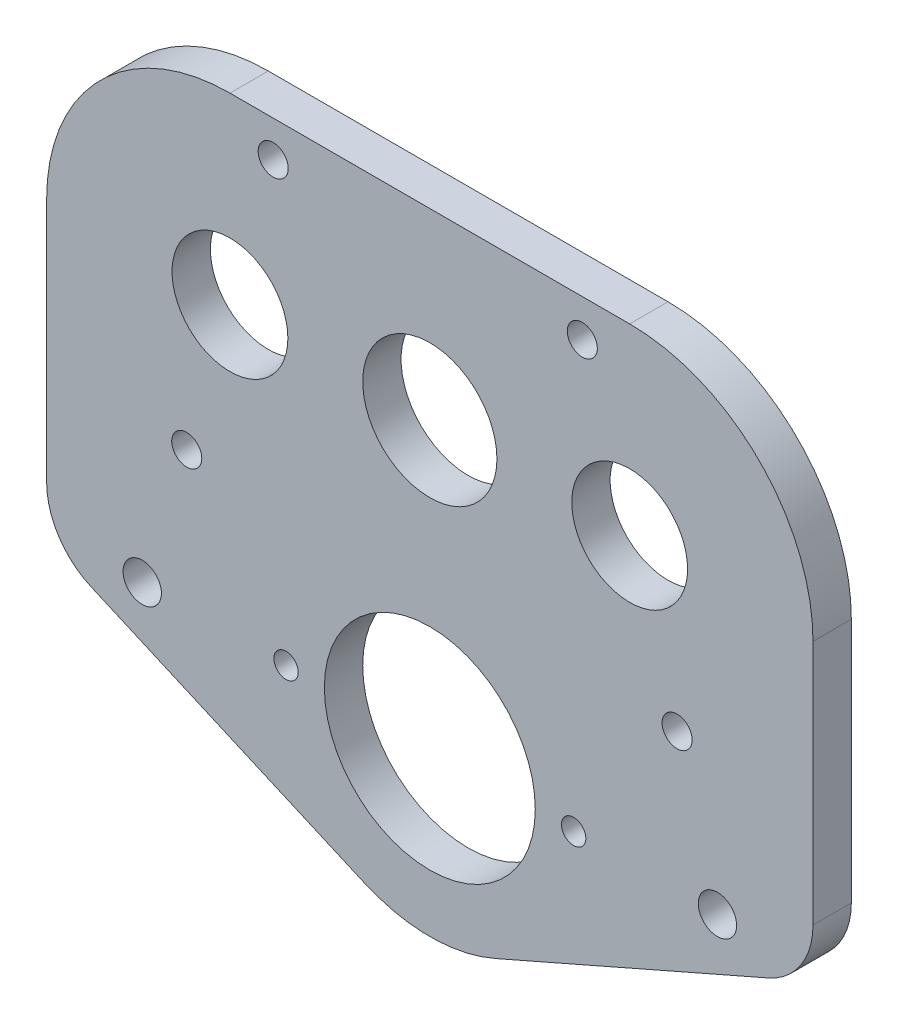
ISO-10303-21;
HEADER;
FILE_DESCRIPTION(('STEP AP214'),'2;1');
FILE_NAME('part.step','',(''),(''),'','','');
FILE_SCHEMA(('AUTOMOTIVE_DESIGN { 1 0 10303 214 1 1 1 1 }'));
ENDSEC;
DATA;
#1=APPLICATION_CONTEXT('core data for automotive mechanical design processes');
#2=APPLICATION_PROTOCOL_DEFINITION('international standard','automotive_design',2000,#1);
#3=PRODUCT_CONTEXT('',#1,'mechanical');
#4=PRODUCT('Part','Part','',(#3));
#5=PRODUCT_RELATED_PRODUCT_CATEGORY('part','',(#4));
#6=PRODUCT_DEFINITION_FORMATION('','',#4);
#7=PRODUCT_DEFINITION_CONTEXT('part definition',#1,'design');
#8=PRODUCT_DEFINITION('design','',#6,#7);
#9=PRODUCT_DEFINITION_SHAPE('','',#8);
#10=(LENGTH_UNIT() NAMED_UNIT(*) SI_UNIT(.MILLI.,.METRE.));
#11=(NAMED_UNIT(*) PLANE_ANGLE_UNIT() SI_UNIT($,.RADIAN.));
#12=(NAMED_UNIT(*) SI_UNIT($,.STERADIAN.) SOLID_ANGLE_UNIT());
#13=UNCERTAINTY_MEASURE_WITH_UNIT(LENGTH_MEASURE(1.E-05),#10,'distance_accuracy_value','');
#14=(GEOMETRIC_REPRESENTATION_CONTEXT(3) GLOBAL_UNCERTAINTY_ASSIGNED_CONTEXT((#13)) GLOBAL_UNIT_ASSIGNED_CONTEXT((#10,
#11,#12)) REPRESENTATION_CONTEXT('',''));
#15=CARTESIAN_POINT('',(0.,0.,0.));
#16=DIRECTION('',(0.,0.,1.));
#17=DIRECTION('',(1.,0.,0.));
#18=AXIS2_PLACEMENT_3D('',#15,#16,#17);
#19=CARTESIAN_POINT('',(-33.0962,47.0662,3.175));
#20=DIRECTION('',(0.,0.,1.));
#21=DIRECTION('',(1.,0.,0.));
#22=AXIS2_PLACEMENT_3D('',#19,#20,#21);
#23=PLANE('',#22);
#24=CARTESIAN_POINT('',(40.9452316571237,22.9093644861031,3.175));
#25=DIRECTION('',(0.,0.,1.));
#26=DIRECTION('',(1.,0.,0.));
#27=AXIS2_PLACEMENT_3D('',#24,#25,#26);
#28=CIRCLE('',#27,2.48919999999999);
#29=CARTESIAN_POINT('',(43.4344316571237,22.9093644861031,3.175));
#30=VERTEX_POINT('',#29);
#31=EDGE_CURVE('E268',#30,#30,#28,.T.);
#32=ORIENTED_EDGE('',*,*,#31,.F.);
#33=EDGE_LOOP('',(#32));
#34=FACE_BOUND('',#33,.T.);
#35=CARTESIAN_POINT('',(-25.9401930562277,71.4373215298082,3.175));
#36=DIRECTION('',(0.,0.,1.));
#37=DIRECTION('',(1.,0.,0.));
#38=AXIS2_PLACEMENT_3D('',#35,#36,#37);
#39=CIRCLE('',#38,2.48919999999999);
#40=CARTESIAN_POINT('',(-23.4509930562277,71.4373215298082,3.175));
#41=VERTEX_POINT('',#40);
#42=EDGE_CURVE('E256',#41,#41,#39,.T.);
#43=ORIENTED_EDGE('',*,*,#42,.F.);
#44=EDGE_LOOP('',(#43));
#45=FACE_BOUND('',#44,.T.);
#46=CARTESIAN_POINT('',(33.0962,47.0662,3.175));
#47=DIRECTION('',(0.,0.,1.));
#48=DIRECTION('',(1.,0.,0.));
#49=AXIS2_PLACEMENT_3D('',#46,#47,#48);
#50=CIRCLE('',#49,9.58850000000001);
#51=CARTESIAN_POINT('',(42.6847,47.0662,3.175));
#52=VERTEX_POINT('',#51);
#53=EDGE_CURVE('E244',#52,#52,#50,.T.);
#54=ORIENTED_EDGE('',*,*,#53,.F.);
#55=EDGE_LOOP('',(#54));
#56=FACE_BOUND('',#55,.T.);
#57=CARTESIAN_POINT('',(23.8125,0.,3.175));
#58=DIRECTION('',(0.,0.,1.));
#59=DIRECTION('',(1.,0.,0.));
#60=AXIS2_PLACEMENT_3D('',#57,#58,#59);
#61=CIRCLE('',#60,2.0193);
#62=CARTESIAN_POINT('',(25.8318,0.,3.175));
#63=VERTEX_POINT('',#62);
#64=EDGE_CURVE('E232',#63,#63,#61,.T.);
#65=ORIENTED_EDGE('',*,*,#64,.F.);
#66=EDGE_LOOP('',(#65));
#67=FACE_BOUND('',#66,.T.);
#68=CARTESIAN_POINT('',(-23.8125,0.,3.175));
#69=DIRECTION('',(0.,0.,1.));
#70=DIRECTION('',(1.,0.,0.));
#71=AXIS2_PLACEMENT_3D('',#68,#69,#70);
#72=CIRCLE('',#71,2.0193);
#73=CARTESIAN_POINT('',(-21.7932,0.,3.175));
#74=VERTEX_POINT('',#73);
#75=EDGE_CURVE('E220',#74,#74,#72,.T.);
#76=ORIENTED_EDGE('',*,*,#75,.F.);
#77=EDGE_LOOP('',(#76));
#78=FACE_BOUND('',#77,.T.);
#79=CARTESIAN_POINT('',(0.,0.,3.175));
#80=DIRECTION('',(0.,0.,1.));
#81=DIRECTION('',(1.,0.,0.));
#82=AXIS2_PLACEMENT_3D('',#79,#80,#81);
#83=CIRCLE('',#82,17.4625);
#84=CARTESIAN_POINT('',(17.4625,0.,3.175));
#85=VERTEX_POINT('',#84);
#86=EDGE_CURVE('E148',#85,#85,#83,.T.);
#87=ORIENTED_EDGE('',*,*,#86,.F.);
#88=EDGE_LOOP('',(#87));
#89=FACE_BOUND('',#88,.T.);
#90=CARTESIAN_POINT('',(-33.0962,47.0662,3.175));
#91=DIRECTION('',(0.,0.,1.));
#92=DIRECTION('',(1.,0.,0.));
#93=AXIS2_PLACEMENT_3D('',#90,#91,#92);
#94=CIRCLE('',#93,30.353);
#95=CARTESIAN_POINT('',(-33.0962,77.4192,3.175));
#96=VERTEX_POINT('',#95);
#97=CARTESIAN_POINT('',(-63.4492,47.0662,3.175));
#98=VERTEX_POINT('',#97);
#99=EDGE_CURVE('E163',#96,#98,#94,.T.);
#100=ORIENTED_EDGE('',*,*,#99,.T.);
#101=DIRECTION('',(0.,-1.,0.));
#102=VECTOR('',#101,1.);
#103=CARTESIAN_POINT('',(-63.4492,47.0662,3.175));
#104=LINE('',#103,#102);
#105=CARTESIAN_POINT('',(-63.4492,6.38770190732491,3.175));
#106=VERTEX_POINT('',#105);
#107=EDGE_CURVE('E101',#98,#106,#104,.T.);
#108=ORIENTED_EDGE('',*,*,#107,.T.);
#109=CARTESIAN_POINT('',(-51.1373462989639,6.38770190732491,3.175));
#110=DIRECTION('',(0.,0.,1.));
#111=DIRECTION('',(1.,0.,0.));
#112=AXIS2_PLACEMENT_3D('',#109,#110,#111);
#113=CIRCLE('',#112,12.3118537010361);
#114=CARTESIAN_POINT('',(-56.0792398959086,-4.88879707206552,3.175));
#115=VERTEX_POINT('',#114);
#116=EDGE_CURVE('E184',#106,#115,#113,.T.);
#117=ORIENTED_EDGE('',*,*,#116,.T.);
#118=DIRECTION('',(0.915905862205091,-0.401393138429581,0.));
#119=VECTOR('',#118,1.);
#120=CARTESIAN_POINT('',(-56.0792398959086,-4.88879707206552,3.175));
#121=LINE('',#120,#119);
#122=CARTESIAN_POINT('',(-10.8325973233683,-24.7180094562599,3.175));
#123=VERTEX_POINT('',#122);
#124=EDGE_CURVE('E203',#115,#123,#121,.T.);
#125=ORIENTED_EDGE('',*,*,#124,.T.);
#126=CARTESIAN_POINT('',(0.,0.,3.175));
#127=DIRECTION('',(0.,0.,1.));
#128=DIRECTION('',(1.,0.,0.));
#129=AXIS2_PLACEMENT_3D('',#126,#127,#128);
#130=CIRCLE('',#129,26.9875);
#131=CARTESIAN_POINT('',(10.8324892933223,-24.7180567998388,3.175));
#132=VERTEX_POINT('',#131);
#133=EDGE_CURVE('E200',#123,#132,#130,.T.);
#134=ORIENTED_EDGE('',*,*,#133,.T.);
#135=DIRECTION('',(0.915907616483142,0.401389135463541,0.));
#136=VECTOR('',#135,1.);
#137=CARTESIAN_POINT('',(56.0791906119764,-4.88905440044025,3.175));
#138=LINE('',#137,#136);
#139=CARTESIAN_POINT('',(56.0791906119764,-4.88905440044025,3.175));
#140=VERTEX_POINT('',#139);
#141=EDGE_CURVE('E202',#132,#140,#138,.T.);
#142=ORIENTED_EDGE('',*,*,#141,.T.);
#143=CARTESIAN_POINT('',(51.1373462989639,6.3874661773649,3.175));
#144=DIRECTION('',(0.,0.,1.));
#145=DIRECTION('',(-1.,0.,0.));
#146=AXIS2_PLACEMENT_3D('',#143,#144,#145);
#147=CIRCLE('',#146,12.3118537010361);
#148=CARTESIAN_POINT('',(63.4492,6.3874661773649,3.175));
#149=VERTEX_POINT('',#148);
#150=EDGE_CURVE('E126',#140,#149,#147,.T.);
#151=ORIENTED_EDGE('',*,*,#150,.T.);
#152=DIRECTION('',(0.,1.,0.));
#153=VECTOR('',#152,1.);
#154=CARTESIAN_POINT('',(63.4492,47.0662,3.175));
#155=LINE('',#154,#153);
#156=CARTESIAN_POINT('',(63.4492,47.0662,3.175));
#157=VERTEX_POINT('',#156);
#158=EDGE_CURVE('E120',#149,#157,#155,.T.);
#159=ORIENTED_EDGE('',*,*,#158,.T.);
#160=CARTESIAN_POINT('',(33.0962,47.0662,3.175));
#161=DIRECTION('',(0.,0.,1.));
#162=DIRECTION('',(-1.,0.,0.));
#163=AXIS2_PLACEMENT_3D('',#160,#161,#162);
#164=CIRCLE('',#163,30.353);
#165=CARTESIAN_POINT('',(33.0962,77.4192,3.175));
#166=VERTEX_POINT('',#165);
#167=EDGE_CURVE('E124',#157,#166,#164,.T.);
#168=ORIENTED_EDGE('',*,*,#167,.T.);
#169=DIRECTION('',(-1.,0.,0.));
#170=VECTOR('',#169,1.);
#171=CARTESIAN_POINT('',(-33.0962,77.4192,3.175));
#172=LINE('',#171,#170);
#173=EDGE_CURVE('E52',#166,#96,#172,.T.);
#174=ORIENTED_EDGE('',*,*,#173,.T.);
#175=EDGE_LOOP('',(#100,#108,#117,#125,#134,#142,#151,#159,#168,#174));
#176=FACE_BOUND('',#175,.T.);
#177=CARTESIAN_POINT('',(47.625,0.,3.175));
#178=DIRECTION('',(0.,0.,1.));
#179=DIRECTION('',(1.,0.,0.));
#180=AXIS2_PLACEMENT_3D('',#177,#178,#179);
#181=CIRCLE('',#180,3.175);
#182=CARTESIAN_POINT('',(50.8,0.,3.175));
#183=VERTEX_POINT('',#182);
#184=EDGE_CURVE('E214',#183,#183,#181,.T.);
#185=ORIENTED_EDGE('',*,*,#184,.F.);
#186=EDGE_LOOP('',(#185));
#187=FACE_BOUND('',#186,.T.);
#188=CARTESIAN_POINT('',(-47.625,0.,3.175));
#189=DIRECTION('',(0.,0.,1.));
#190=DIRECTION('',(1.,0.,0.));
#191=AXIS2_PLACEMENT_3D('',#188,#189,#190);
#192=CIRCLE('',#191,3.175);
#193=CARTESIAN_POINT('',(-44.45,0.,3.175));
#194=VERTEX_POINT('',#193);
#195=EDGE_CURVE('E226',#194,#194,#192,.T.);
#196=ORIENTED_EDGE('',*,*,#195,.F.);
#197=EDGE_LOOP('',(#196));
#198=FACE_BOUND('',#197,.T.);
#199=CARTESIAN_POINT('',(0.,47.0662,3.175));
#200=DIRECTION('',(0.,0.,1.));
#201=DIRECTION('',(1.,0.,0.));
#202=AXIS2_PLACEMENT_3D('',#199,#200,#201);
#203=CIRCLE('',#202,11.1125);
#204=CARTESIAN_POINT('',(11.1125,47.0662,3.175));
#205=VERTEX_POINT('',#204);
#206=EDGE_CURVE('E238',#205,#205,#203,.T.);
#207=ORIENTED_EDGE('',*,*,#206,.F.);
#208=EDGE_LOOP('',(#207));
#209=FACE_BOUND('',#208,.T.);
#210=CARTESIAN_POINT('',(-33.0962,47.0662,3.175));
#211=DIRECTION('',(0.,0.,1.));
#212=DIRECTION('',(1.,0.,0.));
#213=AXIS2_PLACEMENT_3D('',#210,#211,#212);
#214=CIRCLE('',#213,9.5885);
#215=CARTESIAN_POINT('',(-23.5077,47.0662,3.175));
#216=VERTEX_POINT('',#215);
#217=EDGE_CURVE('E250',#216,#216,#214,.T.);
#218=ORIENTED_EDGE('',*,*,#217,.F.);
#219=EDGE_LOOP('',(#218));
#220=FACE_BOUND('',#219,.T.);
#221=CARTESIAN_POINT('',(-40.2522069437723,22.6950784701918,3.175));
#222=DIRECTION('',(0.,0.,1.));
#223=DIRECTION('',(1.,0.,0.));
#224=AXIS2_PLACEMENT_3D('',#221,#222,#223);
#225=CIRCLE('',#224,2.4892);
#226=CARTESIAN_POINT('',(-37.7630069437723,22.6950784701918,3.175));
#227=VERTEX_POINT('',#226);
#228=EDGE_CURVE('E262',#227,#227,#225,.T.);
#229=ORIENTED_EDGE('',*,*,#228,.F.);
#230=EDGE_LOOP('',(#229));
#231=FACE_BOUND('',#230,.T.);
#232=CARTESIAN_POINT('',(25.2471683428763,71.2230355138969,3.175));
#233=DIRECTION('',(0.,0.,1.));
#234=DIRECTION('',(1.,0.,0.));
#235=AXIS2_PLACEMENT_3D('',#232,#233,#234);
#236=CIRCLE('',#235,2.4892);
#237=CARTESIAN_POINT('',(27.7363683428763,71.2230355138969,3.175));
#238=VERTEX_POINT('',#237);
#239=EDGE_CURVE('E274',#238,#238,#236,.T.);
#240=ORIENTED_EDGE('',*,*,#239,.F.);
#241=EDGE_LOOP('',(#240));
#242=FACE_BOUND('',#241,.T.);
#243=ADVANCED_FACE('F35',(#34,#45,#56,#67,#78,#89,#176,#187,#198,#209,#220,#231,#242),#23,.T.);
#244=CARTESIAN_POINT('',(-33.0962,47.0662,-3.175));
#245=DIRECTION('',(0.,0.,1.));
#246=DIRECTION('',(1.,0.,0.));
#247=AXIS2_PLACEMENT_3D('',#244,#245,#246);
#248=PLANE('',#247);
#249=CARTESIAN_POINT('',(40.9452316571237,22.9093644861031,-3.175));
#250=DIRECTION('',(0.,0.,1.));
#251=DIRECTION('',(1.,0.,0.));
#252=AXIS2_PLACEMENT_3D('',#249,#250,#251);
#253=CIRCLE('',#252,2.48919999999999);
#254=CARTESIAN_POINT('',(43.4344316571237,22.9093644861031,-3.175));
#255=VERTEX_POINT('',#254);
#256=EDGE_CURVE('E271',#255,#255,#253,.T.);
#257=ORIENTED_EDGE('',*,*,#256,.T.);
#258=EDGE_LOOP('',(#257));
#259=FACE_BOUND('',#258,.T.);
#260=CARTESIAN_POINT('',(-25.9401930562277,71.4373215298082,-3.175));
#261=DIRECTION('',(0.,0.,1.));
#262=DIRECTION('',(1.,0.,0.));
#263=AXIS2_PLACEMENT_3D('',#260,#261,#262);
#264=CIRCLE('',#263,2.48919999999999);
#265=CARTESIAN_POINT('',(-23.4509930562277,71.4373215298082,-3.175));
#266=VERTEX_POINT('',#265);
#267=EDGE_CURVE('E259',#266,#266,#264,.T.);
#268=ORIENTED_EDGE('',*,*,#267,.T.);
#269=EDGE_LOOP('',(#268));
#270=FACE_BOUND('',#269,.T.);
#271=CARTESIAN_POINT('',(33.0962,47.0662,-3.175));
#272=DIRECTION('',(0.,0.,1.));
#273=DIRECTION('',(1.,0.,0.));
#274=AXIS2_PLACEMENT_3D('',#271,#272,#273);
#275=CIRCLE('',#274,9.58850000000001);
#276=CARTESIAN_POINT('',(42.6847,47.0662,-3.175));
#277=VERTEX_POINT('',#276);
#278=EDGE_CURVE('E247',#277,#277,#275,.T.);
#279=ORIENTED_EDGE('',*,*,#278,.T.);
#280=EDGE_LOOP('',(#279));
#281=FACE_BOUND('',#280,.T.);
#282=CARTESIAN_POINT('',(23.8125,0.,-3.175));
#283=DIRECTION('',(0.,0.,1.));
#284=DIRECTION('',(1.,0.,0.));
#285=AXIS2_PLACEMENT_3D('',#282,#283,#284);
#286=CIRCLE('',#285,2.0193);
#287=CARTESIAN_POINT('',(25.8318,0.,-3.175));
#288=VERTEX_POINT('',#287);
#289=EDGE_CURVE('E235',#288,#288,#286,.T.);
#290=ORIENTED_EDGE('',*,*,#289,.T.);
#291=EDGE_LOOP('',(#290));
#292=FACE_BOUND('',#291,.T.);
#293=CARTESIAN_POINT('',(-23.8125,0.,-3.175));
#294=DIRECTION('',(0.,0.,1.));
#295=DIRECTION('',(1.,0.,0.));
#296=AXIS2_PLACEMENT_3D('',#293,#294,#295);
#297=CIRCLE('',#296,2.0193);
#298=CARTESIAN_POINT('',(-21.7932,0.,-3.175));
#299=VERTEX_POINT('',#298);
#300=EDGE_CURVE('E223',#299,#299,#297,.T.);
#301=ORIENTED_EDGE('',*,*,#300,.T.);
#302=EDGE_LOOP('',(#301));
#303=FACE_BOUND('',#302,.T.);
#304=CARTESIAN_POINT('',(0.,0.,-3.175));
#305=DIRECTION('',(0.,0.,1.));
#306=DIRECTION('',(1.,0.,0.));
#307=AXIS2_PLACEMENT_3D('',#304,#305,#306);
#308=CIRCLE('',#307,17.4625);
#309=CARTESIAN_POINT('',(17.4625,0.,-3.175));
#310=VERTEX_POINT('',#309);
#311=EDGE_CURVE('E211',#310,#310,#308,.T.);
#312=ORIENTED_EDGE('',*,*,#311,.T.);
#313=EDGE_LOOP('',(#312));
#314=FACE_BOUND('',#313,.T.);
#315=CARTESIAN_POINT('',(-33.0962,47.0662,-3.175));
#316=DIRECTION('',(0.,0.,1.));
#317=DIRECTION('',(1.,0.,0.));
#318=AXIS2_PLACEMENT_3D('',#315,#316,#317);
#319=CIRCLE('',#318,30.353);
#320=CARTESIAN_POINT('',(-33.0962,77.4192,-3.175));
#321=VERTEX_POINT('',#320);
#322=CARTESIAN_POINT('',(-63.4492,47.0662,-3.175));
#323=VERTEX_POINT('',#322);
#324=EDGE_CURVE('E144',#321,#323,#319,.T.);
#325=ORIENTED_EDGE('',*,*,#324,.F.);
#326=DIRECTION('',(-1.,0.,0.));
#327=VECTOR('',#326,1.);
#328=CARTESIAN_POINT('',(-33.0962,77.4192,-3.175));
#329=LINE('',#328,#327);
#330=CARTESIAN_POINT('',(33.0962,77.4192,-3.175));
#331=VERTEX_POINT('',#330);
#332=EDGE_CURVE('E93',#331,#321,#329,.T.);
#333=ORIENTED_EDGE('',*,*,#332,.F.);
#334=CARTESIAN_POINT('',(33.0962,47.0662,-3.175));
#335=DIRECTION('',(0.,0.,1.));
#336=DIRECTION('',(-1.,0.,0.));
#337=AXIS2_PLACEMENT_3D('',#334,#335,#336);
#338=CIRCLE('',#337,30.353);
#339=CARTESIAN_POINT('',(63.4492,47.0662,-3.175));
#340=VERTEX_POINT('',#339);
#341=EDGE_CURVE('E87',#340,#331,#338,.T.);
#342=ORIENTED_EDGE('',*,*,#341,.F.);
#343=DIRECTION('',(0.,1.,0.));
#344=VECTOR('',#343,1.);
#345=CARTESIAN_POINT('',(63.4492,47.0662,-3.175));
#346=LINE('',#345,#344);
#347=CARTESIAN_POINT('',(63.4492,6.3874661773649,-3.175));
#348=VERTEX_POINT('',#347);
#349=EDGE_CURVE('E134',#348,#340,#346,.T.);
#350=ORIENTED_EDGE('',*,*,#349,.F.);
#351=CARTESIAN_POINT('',(51.1373462989639,6.3874661773649,-3.175));
#352=DIRECTION('',(0.,0.,1.));
#353=DIRECTION('',(-1.,0.,0.));
#354=AXIS2_PLACEMENT_3D('',#351,#352,#353);
#355=CIRCLE('',#354,12.3118537010361);
#356=CARTESIAN_POINT('',(56.0791906119764,-4.88905440044025,-3.175));
#357=VERTEX_POINT('',#356);
#358=EDGE_CURVE('E158',#357,#348,#355,.T.);
#359=ORIENTED_EDGE('',*,*,#358,.F.);
#360=DIRECTION('',(0.915907616483142,0.401389135463541,0.));
#361=VECTOR('',#360,1.);
#362=CARTESIAN_POINT('',(56.0791906119764,-4.88905440044025,-3.175));
#363=LINE('',#362,#361);
#364=CARTESIAN_POINT('',(10.8324892933223,-24.7180567998388,-3.175));
#365=VERTEX_POINT('',#364);
#366=EDGE_CURVE('E156',#365,#357,#363,.T.);
#367=ORIENTED_EDGE('',*,*,#366,.F.);
#368=CARTESIAN_POINT('',(0.,0.,-3.175));
#369=DIRECTION('',(0.,0.,1.));
#370=DIRECTION('',(1.,0.,0.));
#371=AXIS2_PLACEMENT_3D('',#368,#369,#370);
#372=CIRCLE('',#371,26.9875);
#373=CARTESIAN_POINT('',(-10.8325973233683,-24.7180094562599,-3.175));
#374=VERTEX_POINT('',#373);
#375=EDGE_CURVE('E154',#374,#365,#372,.T.);
#376=ORIENTED_EDGE('',*,*,#375,.F.);
#377=DIRECTION('',(0.915905862205091,-0.401393138429581,0.));
#378=VECTOR('',#377,1.);
#379=CARTESIAN_POINT('',(-56.0792398959086,-4.88879707206552,-3.175));
#380=LINE('',#379,#378);
#381=CARTESIAN_POINT('',(-56.0792398959086,-4.88879707206552,-3.175));
#382=VERTEX_POINT('',#381);
#383=EDGE_CURVE('E152',#382,#374,#380,.T.);
#384=ORIENTED_EDGE('',*,*,#383,.F.);
#385=CARTESIAN_POINT('',(-51.1373462989639,6.38770190732491,-3.175));
#386=DIRECTION('',(0.,0.,1.));
#387=DIRECTION('',(1.,0.,0.));
#388=AXIS2_PLACEMENT_3D('',#385,#386,#387);
#389=CIRCLE('',#388,12.3118537010361);
#390=CARTESIAN_POINT('',(-63.4492,6.38770190732491,-3.175));
#391=VERTEX_POINT('',#390);
#392=EDGE_CURVE('E150',#391,#382,#389,.T.);
#393=ORIENTED_EDGE('',*,*,#392,.F.);
#394=DIRECTION('',(0.,-1.,0.));
#395=VECTOR('',#394,1.);
#396=CARTESIAN_POINT('',(-63.4492,47.0662,-3.175));
#397=LINE('',#396,#395);
#398=EDGE_CURVE('E147',#323,#391,#397,.T.);
#399=ORIENTED_EDGE('',*,*,#398,.F.);
#400=EDGE_LOOP('',(#325,#333,#342,#350,#359,#367,#376,#384,#393,#399));
#401=FACE_BOUND('',#400,.T.);
#402=CARTESIAN_POINT('',(47.625,0.,-3.175));
#403=DIRECTION('',(0.,0.,1.));
#404=DIRECTION('',(1.,0.,0.));
#405=AXIS2_PLACEMENT_3D('',#402,#403,#404);
#406=CIRCLE('',#405,3.175);
#407=CARTESIAN_POINT('',(50.8,0.,-3.175));
#408=VERTEX_POINT('',#407);
#409=EDGE_CURVE('E217',#408,#408,#406,.T.);
#410=ORIENTED_EDGE('',*,*,#409,.T.);
#411=EDGE_LOOP('',(#410));
#412=FACE_BOUND('',#411,.T.);
#413=CARTESIAN_POINT('',(-47.625,0.,-3.175));
#414=DIRECTION('',(0.,0.,1.));
#415=DIRECTION('',(1.,0.,0.));
#416=AXIS2_PLACEMENT_3D('',#413,#414,#415);
#417=CIRCLE('',#416,3.175);
#418=CARTESIAN_POINT('',(-44.45,0.,-3.175));
#419=VERTEX_POINT('',#418);
#420=EDGE_CURVE('E229',#419,#419,#417,.T.);
#421=ORIENTED_EDGE('',*,*,#420,.T.);
#422=EDGE_LOOP('',(#421));
#423=FACE_BOUND('',#422,.T.);
#424=CARTESIAN_POINT('',(0.,47.0662,-3.175));
#425=DIRECTION('',(0.,0.,1.));
#426=DIRECTION('',(1.,0.,0.));
#427=AXIS2_PLACEMENT_3D('',#424,#425,#426);
#428=CIRCLE('',#427,11.1125);
#429=CARTESIAN_POINT('',(11.1125,47.0662,-3.175));
#430=VERTEX_POINT('',#429);
#431=EDGE_CURVE('E241',#430,#430,#428,.T.);
#432=ORIENTED_EDGE('',*,*,#431,.T.);
#433=EDGE_LOOP('',(#432));
#434=FACE_BOUND('',#433,.T.);
#435=CARTESIAN_POINT('',(-33.0962,47.0662,-3.175));
#436=DIRECTION('',(0.,0.,1.));
#437=DIRECTION('',(1.,0.,0.));
#438=AXIS2_PLACEMENT_3D('',#435,#436,#437);
#439=CIRCLE('',#438,9.5885);
#440=CARTESIAN_POINT('',(-23.5077,47.0662,-3.175));
#441=VERTEX_POINT('',#440);
#442=EDGE_CURVE('E253',#441,#441,#439,.T.);
#443=ORIENTED_EDGE('',*,*,#442,.T.);
#444=EDGE_LOOP('',(#443));
#445=FACE_BOUND('',#444,.T.);
#446=CARTESIAN_POINT('',(-40.2522069437723,22.6950784701918,-3.175));
#447=DIRECTION('',(0.,0.,1.));
#448=DIRECTION('',(1.,0.,0.));
#449=AXIS2_PLACEMENT_3D('',#446,#447,#448);
#450=CIRCLE('',#449,2.4892);
#451=CARTESIAN_POINT('',(-37.7630069437723,22.6950784701918,-3.175));
#452=VERTEX_POINT('',#451);
#453=EDGE_CURVE('E265',#452,#452,#450,.T.);
#454=ORIENTED_EDGE('',*,*,#453,.T.);
#455=EDGE_LOOP('',(#454));
#456=FACE_BOUND('',#455,.T.);
#457=CARTESIAN_POINT('',(25.2471683428763,71.2230355138969,-3.175));
#458=DIRECTION('',(0.,0.,1.));
#459=DIRECTION('',(1.,0.,0.));
#460=AXIS2_PLACEMENT_3D('',#457,#458,#459);
#461=CIRCLE('',#460,2.4892);
#462=CARTESIAN_POINT('',(27.7363683428763,71.2230355138969,-3.175));
#463=VERTEX_POINT('',#462);
#464=EDGE_CURVE('E277',#463,#463,#461,.T.);
#465=ORIENTED_EDGE('',*,*,#464,.T.);
#466=EDGE_LOOP('',(#465));
#467=FACE_BOUND('',#466,.T.);
#468=ADVANCED_FACE('F188',(#259,#270,#281,#292,#303,#314,#401,#412,#423,#434,#445,#456,#467),
#248,.F.);
#469=CARTESIAN_POINT('',(-33.0962,47.0662,3.175));
#470=DIRECTION('',(0.,0.,-1.));
#471=DIRECTION('',(-1.,0.,0.));
#472=AXIS2_PLACEMENT_3D('',#469,#470,#471);
#473=CYLINDRICAL_SURFACE('',#472,30.353);
#474=ORIENTED_EDGE('',*,*,#324,.T.);
#475=DIRECTION('',(0.,0.,-1.));
#476=VECTOR('',#475,1.);
#477=CARTESIAN_POINT('',(-63.4492,47.0662,3.175));
#478=LINE('',#477,#476);
#479=EDGE_CURVE('E11',#98,#323,#478,.T.);
#480=ORIENTED_EDGE('',*,*,#479,.F.);
#481=ORIENTED_EDGE('',*,*,#99,.F.);
#482=DIRECTION('',(0.,0.,-1.));
#483=VECTOR('',#482,1.);
#484=CARTESIAN_POINT('',(-33.0962,77.4192,3.175));
#485=LINE('',#484,#483);
#486=EDGE_CURVE('E140',#96,#321,#485,.T.);
#487=ORIENTED_EDGE('',*,*,#486,.T.);
#488=EDGE_LOOP('',(#474,#480,#481,#487));
#489=FACE_BOUND('',#488,.T.);
#490=ADVANCED_FACE('F37',(#489),#473,.T.);
#491=CARTESIAN_POINT('',(-63.4492,47.0662,3.175));
#492=DIRECTION('',(1.,0.,0.));
#493=DIRECTION('',(0.,0.,-1.));
#494=AXIS2_PLACEMENT_3D('',#491,#492,#493);
#495=PLANE('',#494);
#496=ORIENTED_EDGE('',*,*,#398,.T.);
#497=DIRECTION('',(0.,0.,-1.));
#498=VECTOR('',#497,1.);
#499=CARTESIAN_POINT('',(-63.4492,6.38770190732491,3.175));
#500=LINE('',#499,#498);
#501=EDGE_CURVE('E44',#106,#391,#500,.T.);
#502=ORIENTED_EDGE('',*,*,#501,.F.);
#503=ORIENTED_EDGE('',*,*,#107,.F.);
#504=ORIENTED_EDGE('',*,*,#479,.T.);
#505=EDGE_LOOP('',(#496,#502,#503,#504));
#506=FACE_BOUND('',#505,.T.);
#507=ADVANCED_FACE('F320',(#506),#495,.F.);
#508=CARTESIAN_POINT('',(-51.1373462989639,6.38770190732491,3.175));
#509=DIRECTION('',(0.,0.,-1.));
#510=DIRECTION('',(-1.,0.,0.));
#511=AXIS2_PLACEMENT_3D('',#508,#509,#510);
#512=CYLINDRICAL_SURFACE('',#511,12.3118537010361);
#513=ORIENTED_EDGE('',*,*,#392,.T.);
#514=DIRECTION('',(0.,0.,-1.));
#515=VECTOR('',#514,1.);
#516=CARTESIAN_POINT('',(-56.0792398959086,-4.88879707206552,3.175));
#517=LINE('',#516,#515);
#518=EDGE_CURVE('E176',#115,#382,#517,.T.);
#519=ORIENTED_EDGE('',*,*,#518,.F.);
#520=ORIENTED_EDGE('',*,*,#116,.F.);
#521=ORIENTED_EDGE('',*,*,#501,.T.);
#522=EDGE_LOOP('',(#513,#519,#520,#521));
#523=FACE_BOUND('',#522,.T.);
#524=ADVANCED_FACE('F182',(#523),#512,.T.);
#525=CARTESIAN_POINT('',(-56.0792398959086,-4.88879707206552,3.175));
#526=DIRECTION('',(0.401393138429581,0.915905862205091,0.));
#527=DIRECTION('',(-0.915905862205091,0.401393138429581,0.));
#528=AXIS2_PLACEMENT_3D('',#525,#526,#527);
#529=PLANE('',#528);
#530=ORIENTED_EDGE('',*,*,#383,.T.);
#531=DIRECTION('',(0.,0.,-1.));
#532=VECTOR('',#531,1.);
#533=CARTESIAN_POINT('',(-10.8325973233683,-24.7180094562599,3.175));
#534=LINE('',#533,#532);
#535=EDGE_CURVE('E173',#123,#374,#534,.T.);
#536=ORIENTED_EDGE('',*,*,#535,.F.);
#537=ORIENTED_EDGE('',*,*,#124,.F.);
#538=ORIENTED_EDGE('',*,*,#518,.T.);
#539=EDGE_LOOP('',(#530,#536,#537,#538));
#540=FACE_BOUND('',#539,.T.);
#541=ADVANCED_FACE('F194',(#540),#529,.F.);
#542=CARTESIAN_POINT('',(0.,0.,3.175));
#543=DIRECTION('',(0.,0.,-1.));
#544=DIRECTION('',(-1.,0.,0.));
#545=AXIS2_PLACEMENT_3D('',#542,#543,#544);
#546=CYLINDRICAL_SURFACE('',#545,26.9875);
#547=ORIENTED_EDGE('',*,*,#375,.T.);
#548=DIRECTION('',(0.,0.,-1.));
#549=VECTOR('',#548,1.);
#550=CARTESIAN_POINT('',(10.8324892933223,-24.7180567998388,3.175));
#551=LINE('',#550,#549);
#552=EDGE_CURVE('E170',#132,#365,#551,.T.);
#553=ORIENTED_EDGE('',*,*,#552,.F.);
#554=ORIENTED_EDGE('',*,*,#133,.F.);
#555=ORIENTED_EDGE('',*,*,#535,.T.);
#556=EDGE_LOOP('',(#547,#553,#554,#555));
#557=FACE_BOUND('',#556,.T.);
#558=ADVANCED_FACE('F198',(#557),#546,.T.);
#559=CARTESIAN_POINT('',(56.0791906119764,-4.88905440044025,3.175));
#560=DIRECTION('',(-0.401389135463541,0.915907616483142,0.));
#561=DIRECTION('',(-0.915907616483142,-0.401389135463541,0.));
#562=AXIS2_PLACEMENT_3D('',#559,#560,#561);
#563=PLANE('',#562);
#564=ORIENTED_EDGE('',*,*,#366,.T.);
#565=DIRECTION('',(0.,0.,-1.));
#566=VECTOR('',#565,1.);
#567=CARTESIAN_POINT('',(56.0791906119764,-4.88905440044025,3.175));
#568=LINE('',#567,#566);
#569=EDGE_CURVE('E167',#140,#357,#568,.T.);
#570=ORIENTED_EDGE('',*,*,#569,.F.);
#571=ORIENTED_EDGE('',*,*,#141,.F.);
#572=ORIENTED_EDGE('',*,*,#552,.T.);
#573=EDGE_LOOP('',(#564,#570,#571,#572));
#574=FACE_BOUND('',#573,.T.);
#575=ADVANCED_FACE('F310',(#574),#563,.F.);
#576=CARTESIAN_POINT('',(51.1373462989639,6.3874661773649,3.175));
#577=DIRECTION('',(0.,0.,-1.));
#578=DIRECTION('',(-1.,0.,0.));
#579=AXIS2_PLACEMENT_3D('',#576,#577,#578);
#580=CYLINDRICAL_SURFACE('',#579,12.3118537010361);
#581=ORIENTED_EDGE('',*,*,#358,.T.);
#582=DIRECTION('',(0.,0.,-1.));
#583=VECTOR('',#582,1.);
#584=CARTESIAN_POINT('',(63.4492,6.3874661773649,3.175));
#585=LINE('',#584,#583);
#586=EDGE_CURVE('E135',#149,#348,#585,.T.);
#587=ORIENTED_EDGE('',*,*,#586,.F.);
#588=ORIENTED_EDGE('',*,*,#150,.F.);
#589=ORIENTED_EDGE('',*,*,#569,.T.);
#590=EDGE_LOOP('',(#581,#587,#588,#589));
#591=FACE_BOUND('',#590,.T.);
#592=ADVANCED_FACE('F307',(#591),#580,.T.);
#593=CARTESIAN_POINT('',(63.4492,47.0662,3.175));
#594=DIRECTION('',(-1.,0.,0.));
#595=DIRECTION('',(0.,-1.,0.));
#596=AXIS2_PLACEMENT_3D('',#593,#594,#595);
#597=PLANE('',#596);
#598=ORIENTED_EDGE('',*,*,#349,.T.);
#599=DIRECTION('',(0.,0.,-1.));
#600=VECTOR('',#599,1.);
#601=CARTESIAN_POINT('',(63.4492,47.0662,3.175));
#602=LINE('',#601,#600);
#603=EDGE_CURVE('E131',#157,#340,#602,.T.);
#604=ORIENTED_EDGE('',*,*,#603,.F.);
#605=ORIENTED_EDGE('',*,*,#158,.F.);
#606=ORIENTED_EDGE('',*,*,#586,.T.);
#607=EDGE_LOOP('',(#598,#604,#605,#606));
#608=FACE_BOUND('',#607,.T.);
#609=ADVANCED_FACE('F132',(#608),#597,.F.);
#610=CARTESIAN_POINT('',(33.0962,47.0662,3.175));
#611=DIRECTION('',(0.,0.,-1.));
#612=DIRECTION('',(-1.,0.,0.));
#613=AXIS2_PLACEMENT_3D('',#610,#611,#612);
#614=CYLINDRICAL_SURFACE('',#613,30.353);
#615=ORIENTED_EDGE('',*,*,#341,.T.);
#616=DIRECTION('',(0.,0.,-1.));
#617=VECTOR('',#616,1.);
#618=CARTESIAN_POINT('',(33.0962,77.4192,3.175));
#619=LINE('',#618,#617);
#620=EDGE_CURVE('E136',#166,#331,#619,.T.);
#621=ORIENTED_EDGE('',*,*,#620,.F.);
#622=ORIENTED_EDGE('',*,*,#167,.F.);
#623=ORIENTED_EDGE('',*,*,#603,.T.);
#624=EDGE_LOOP('',(#615,#621,#622,#623));
#625=FACE_BOUND('',#624,.T.);
#626=ADVANCED_FACE('F138',(#625),#614,.T.);
#627=CARTESIAN_POINT('',(-33.0962,77.4192,3.175));
#628=DIRECTION('',(0.,-1.,0.));
#629=DIRECTION('',(0.,0.,-1.));
#630=AXIS2_PLACEMENT_3D('',#627,#628,#629);
#631=PLANE('',#630);
#632=ORIENTED_EDGE('',*,*,#332,.T.);
#633=ORIENTED_EDGE('',*,*,#486,.F.);
#634=ORIENTED_EDGE('',*,*,#173,.F.);
#635=ORIENTED_EDGE('',*,*,#620,.T.);
#636=EDGE_LOOP('',(#632,#633,#634,#635));
#637=FACE_BOUND('',#636,.T.);
#638=ADVANCED_FACE('F300',(#637),#631,.F.);
#639=CARTESIAN_POINT('',(0.,0.,3.175));
#640=DIRECTION('',(0.,0.,-1.));
#641=DIRECTION('',(-1.,0.,0.));
#642=AXIS2_PLACEMENT_3D('',#639,#640,#641);
#643=CYLINDRICAL_SURFACE('',#642,17.4625);
#644=ORIENTED_EDGE('',*,*,#86,.T.);
#645=EDGE_LOOP('',(#644));
#646=FACE_BOUND('',#645,.T.);
#647=ORIENTED_EDGE('',*,*,#311,.F.);
#648=EDGE_LOOP('',(#647));
#649=FACE_BOUND('',#648,.T.);
#650=ADVANCED_FACE('F297',(#646,#649),#643,.F.);
#651=CARTESIAN_POINT('',(47.625,0.,3.175));
#652=DIRECTION('',(0.,0.,-1.));
#653=DIRECTION('',(-1.,0.,0.));
#654=AXIS2_PLACEMENT_3D('',#651,#652,#653);
#655=CYLINDRICAL_SURFACE('',#654,3.175);
#656=ORIENTED_EDGE('',*,*,#184,.T.);
#657=EDGE_LOOP('',(#656));
#658=FACE_BOUND('',#657,.T.);
#659=ORIENTED_EDGE('',*,*,#409,.F.);
#660=EDGE_LOOP('',(#659));
#661=FACE_BOUND('',#660,.T.);
#662=ADVANCED_FACE('F396',(#658,#661),#655,.F.);
#663=CARTESIAN_POINT('',(-23.8125,0.,3.175));
#664=DIRECTION('',(0.,0.,-1.));
#665=DIRECTION('',(-1.,0.,0.));
#666=AXIS2_PLACEMENT_3D('',#663,#664,#665);
#667=CYLINDRICAL_SURFACE('',#666,2.0193);
#668=ORIENTED_EDGE('',*,*,#75,.T.);
#669=EDGE_LOOP('',(#668));
#670=FACE_BOUND('',#669,.T.);
#671=ORIENTED_EDGE('',*,*,#300,.F.);
#672=EDGE_LOOP('',(#671));
#673=FACE_BOUND('',#672,.T.);
#674=ADVANCED_FACE('F404',(#670,#673),#667,.F.);
#675=CARTESIAN_POINT('',(-47.625,0.,3.175));
#676=DIRECTION('',(0.,0.,-1.));
#677=DIRECTION('',(-1.,0.,0.));
#678=AXIS2_PLACEMENT_3D('',#675,#676,#677);
#679=CYLINDRICAL_SURFACE('',#678,3.175);
#680=ORIENTED_EDGE('',*,*,#195,.T.);
#681=EDGE_LOOP('',(#680));
#682=FACE_BOUND('',#681,.T.);
#683=ORIENTED_EDGE('',*,*,#420,.F.);
#684=EDGE_LOOP('',(#683));
#685=FACE_BOUND('',#684,.T.);
#686=ADVANCED_FACE('F412',(#682,#685),#679,.F.);
#687=CARTESIAN_POINT('',(23.8125,0.,3.175));
#688=DIRECTION('',(0.,0.,-1.));
#689=DIRECTION('',(-1.,0.,0.));
#690=AXIS2_PLACEMENT_3D('',#687,#688,#689);
#691=CYLINDRICAL_SURFACE('',#690,2.0193);
#692=ORIENTED_EDGE('',*,*,#64,.T.);
#693=EDGE_LOOP('',(#692));
#694=FACE_BOUND('',#693,.T.);
#695=ORIENTED_EDGE('',*,*,#289,.F.);
#696=EDGE_LOOP('',(#695));
#697=FACE_BOUND('',#696,.T.);
#698=ADVANCED_FACE('F421',(#694,#697),#691,.F.);
#699=CARTESIAN_POINT('',(0.,47.0662,3.175));
#700=DIRECTION('',(0.,0.,-1.));
#701=DIRECTION('',(-1.,0.,0.));
#702=AXIS2_PLACEMENT_3D('',#699,#700,#701);
#703=CYLINDRICAL_SURFACE('',#702,11.1125);
#704=ORIENTED_EDGE('',*,*,#206,.T.);
#705=EDGE_LOOP('',(#704));
#706=FACE_BOUND('',#705,.T.);
#707=ORIENTED_EDGE('',*,*,#431,.F.);
#708=EDGE_LOOP('',(#707));
#709=FACE_BOUND('',#708,.T.);
#710=ADVANCED_FACE('F430',(#706,#709),#703,.F.);
#711=CARTESIAN_POINT('',(33.0962,47.0662,3.175));
#712=DIRECTION('',(0.,0.,-1.));
#713=DIRECTION('',(-1.,0.,0.));
#714=AXIS2_PLACEMENT_3D('',#711,#712,#713);
#715=CYLINDRICAL_SURFACE('',#714,9.58850000000001);
#716=ORIENTED_EDGE('',*,*,#53,.T.);
#717=EDGE_LOOP('',(#716));
#718=FACE_BOUND('',#717,.T.);
#719=ORIENTED_EDGE('',*,*,#278,.F.);
#720=EDGE_LOOP('',(#719));
#721=FACE_BOUND('',#720,.T.);
#722=ADVANCED_FACE('F439',(#718,#721),#715,.F.);
#723=CARTESIAN_POINT('',(-33.0962,47.0662,3.175));
#724=DIRECTION('',(0.,0.,-1.));
#725=DIRECTION('',(-1.,0.,0.));
#726=AXIS2_PLACEMENT_3D('',#723,#724,#725);
#727=CYLINDRICAL_SURFACE('',#726,9.5885);
#728=ORIENTED_EDGE('',*,*,#217,.T.);
#729=EDGE_LOOP('',(#728));
#730=FACE_BOUND('',#729,.T.);
#731=ORIENTED_EDGE('',*,*,#442,.F.);
#732=EDGE_LOOP('',(#731));
#733=FACE_BOUND('',#732,.T.);
#734=ADVANCED_FACE('F448',(#730,#733),#727,.F.);
#735=CARTESIAN_POINT('',(-25.9401930562277,71.4373215298082,3.175));
#736=DIRECTION('',(0.,0.,-1.));
#737=DIRECTION('',(-1.,0.,0.));
#738=AXIS2_PLACEMENT_3D('',#735,#736,#737);
#739=CYLINDRICAL_SURFACE('',#738,2.48919999999999);
#740=ORIENTED_EDGE('',*,*,#42,.T.);
#741=EDGE_LOOP('',(#740));
#742=FACE_BOUND('',#741,.T.);
#743=ORIENTED_EDGE('',*,*,#267,.F.);
#744=EDGE_LOOP('',(#743));
#745=FACE_BOUND('',#744,.T.);
#746=ADVANCED_FACE('F457',(#742,#745),#739,.F.);
#747=CARTESIAN_POINT('',(-40.2522069437723,22.6950784701918,3.175));
#748=DIRECTION('',(0.,0.,-1.));
#749=DIRECTION('',(-1.,0.,0.));
#750=AXIS2_PLACEMENT_3D('',#747,#748,#749);
#751=CYLINDRICAL_SURFACE('',#750,2.4892);
#752=ORIENTED_EDGE('',*,*,#228,.T.);
#753=EDGE_LOOP('',(#752));
#754=FACE_BOUND('',#753,.T.);
#755=ORIENTED_EDGE('',*,*,#453,.F.);
#756=EDGE_LOOP('',(#755));
#757=FACE_BOUND('',#756,.T.);
#758=ADVANCED_FACE('F466',(#754,#757),#751,.F.);
#759=CARTESIAN_POINT('',(40.9452316571237,22.9093644861031,3.175));
#760=DIRECTION('',(0.,0.,-1.));
#761=DIRECTION('',(-1.,0.,0.));
#762=AXIS2_PLACEMENT_3D('',#759,#760,#761);
#763=CYLINDRICAL_SURFACE('',#762,2.48919999999999);
#764=ORIENTED_EDGE('',*,*,#31,.T.);
#765=EDGE_LOOP('',(#764));
#766=FACE_BOUND('',#765,.T.);
#767=ORIENTED_EDGE('',*,*,#256,.F.);
#768=EDGE_LOOP('',(#767));
#769=FACE_BOUND('',#768,.T.);
#770=ADVANCED_FACE('F475',(#766,#769),#763,.F.);
#771=CARTESIAN_POINT('',(25.2471683428763,71.2230355138969,3.175));
#772=DIRECTION('',(0.,0.,-1.));
#773=DIRECTION('',(-1.,0.,0.));
#774=AXIS2_PLACEMENT_3D('',#771,#772,#773);
#775=CYLINDRICAL_SURFACE('',#774,2.4892);
#776=ORIENTED_EDGE('',*,*,#239,.T.);
#777=EDGE_LOOP('',(#776));
#778=FACE_BOUND('',#777,.T.);
#779=ORIENTED_EDGE('',*,*,#464,.F.);
#780=EDGE_LOOP('',(#779));
#781=FACE_BOUND('',#780,.T.);
#782=ADVANCED_FACE('F283',(#778,#781),#775,.F.);
#783=CLOSED_SHELL('',(#243,#468,#490,#507,#524,#541,#558,#575,#592,#609,#626,#638,#650,#662,
#674,#686,#698,#710,#722,#734,#746,#758,#770,#782));
#784=MANIFOLD_SOLID_BREP('B2',#783);
#785=ADVANCED_BREP_SHAPE_REPRESENTATION('',(#18,#784),#14);
#786=SHAPE_DEFINITION_REPRESENTATION(#9,#785);
ENDSEC;
END-ISO-10303-21;
